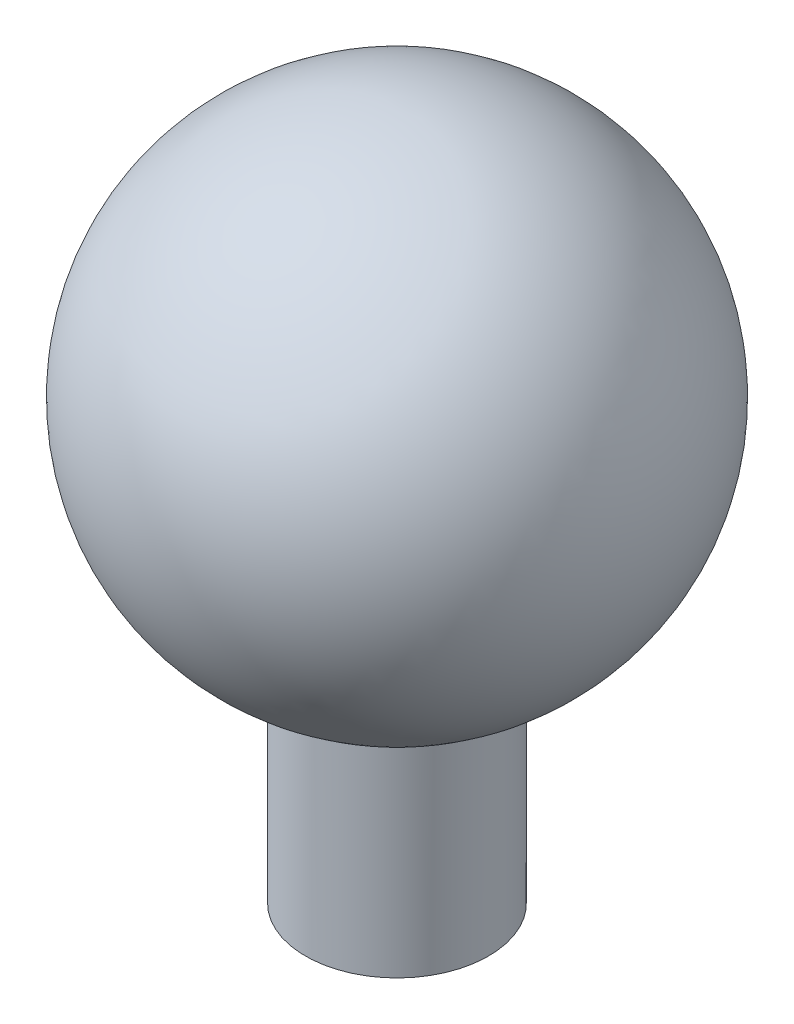
ISO-10303-21;
HEADER;
FILE_DESCRIPTION(('STEP AP214'),'2;1');
FILE_NAME('part.step','',(''),(''),'','','');
FILE_SCHEMA(('AUTOMOTIVE_DESIGN { 1 0 10303 214 1 1 1 1 }'));
ENDSEC;
DATA;
#1=APPLICATION_CONTEXT('core data for automotive mechanical design processes');
#2=APPLICATION_PROTOCOL_DEFINITION('international standard','automotive_design',2000,#1);
#3=PRODUCT_CONTEXT('',#1,'mechanical');
#4=PRODUCT('Part','Part','',(#3));
#5=PRODUCT_RELATED_PRODUCT_CATEGORY('part','',(#4));
#6=PRODUCT_DEFINITION_FORMATION('','',#4);
#7=PRODUCT_DEFINITION_CONTEXT('part definition',#1,'design');
#8=PRODUCT_DEFINITION('design','',#6,#7);
#9=PRODUCT_DEFINITION_SHAPE('','',#8);
#10=(LENGTH_UNIT() NAMED_UNIT(*) SI_UNIT(.MILLI.,.METRE.));
#11=(NAMED_UNIT(*) PLANE_ANGLE_UNIT() SI_UNIT($,.RADIAN.));
#12=(NAMED_UNIT(*) SI_UNIT($,.STERADIAN.) SOLID_ANGLE_UNIT());
#13=UNCERTAINTY_MEASURE_WITH_UNIT(LENGTH_MEASURE(1.E-05),#10,'distance_accuracy_value','');
#14=(GEOMETRIC_REPRESENTATION_CONTEXT(3) GLOBAL_UNCERTAINTY_ASSIGNED_CONTEXT((#13)) GLOBAL_UNIT_ASSIGNED_CONTEXT((#10,
#11,#12)) REPRESENTATION_CONTEXT('',''));
#15=CARTESIAN_POINT('',(0.,0.,0.));
#16=DIRECTION('',(0.,0.,1.));
#17=DIRECTION('',(1.,0.,0.));
#18=AXIS2_PLACEMENT_3D('',#15,#16,#17);
#19=CARTESIAN_POINT('',(0.,57.5,0.));
#20=DIRECTION('',(0.,-1.,0.));
#21=DIRECTION('',(1.,0.,0.));
#22=AXIS2_PLACEMENT_3D('',#19,#20,#21);
#23=SPHERICAL_SURFACE('',#22,32.5);
#24=CARTESIAN_POINT('',(0.,27.2965233789221,0.));
#25=DIRECTION('',(0.,-1.,0.));
#26=DIRECTION('',(0.,0.,-1.));
#27=AXIS2_PLACEMENT_3D('',#24,#25,#26);
#28=CIRCLE('',#27,12.);
#29=CARTESIAN_POINT('',(0.,27.2965233789221,-12.));
#30=VERTEX_POINT('',#29);
#31=EDGE_CURVE('E10',#30,#30,#28,.T.);
#32=ORIENTED_EDGE('',*,*,#31,.F.);
#33=EDGE_LOOP('',(#32));
#34=FACE_BOUND('',#33,.T.);
#35=ADVANCED_FACE('F45',(#34),#23,.T.);
#36=CARTESIAN_POINT('',(0.,0.,0.));
#37=DIRECTION('',(0.,-1.,0.));
#38=DIRECTION('',(0.,0.,-1.));
#39=AXIS2_PLACEMENT_3D('',#36,#37,#38);
#40=CYLINDRICAL_SURFACE('',#39,12.);
#41=CARTESIAN_POINT('',(0.,0.,0.));
#42=DIRECTION('',(0.,-1.,0.));
#43=DIRECTION('',(0.,0.,-1.));
#44=AXIS2_PLACEMENT_3D('',#41,#42,#43);
#45=CIRCLE('',#44,12.);
#46=CARTESIAN_POINT('',(0.,0.,-12.));
#47=VERTEX_POINT('',#46);
#48=EDGE_CURVE('E51',#47,#47,#45,.T.);
#49=ORIENTED_EDGE('',*,*,#48,.F.);
#50=EDGE_LOOP('',(#49));
#51=FACE_BOUND('',#50,.T.);
#52=ORIENTED_EDGE('',*,*,#31,.T.);
#53=EDGE_LOOP('',(#52));
#54=FACE_BOUND('',#53,.T.);
#55=ADVANCED_FACE('F69',(#51,#54),#40,.T.);
#56=CARTESIAN_POINT('',(0.,0.,0.));
#57=DIRECTION('',(0.,1.,0.));
#58=DIRECTION('',(0.,0.,1.));
#59=AXIS2_PLACEMENT_3D('',#56,#57,#58);
#60=PLANE('',#59);
#61=CARTESIAN_POINT('',(0.,0.,0.));
#62=DIRECTION('',(0.,-1.,0.));
#63=DIRECTION('',(0.,0.,-1.));
#64=AXIS2_PLACEMENT_3D('',#61,#62,#63);
#65=CIRCLE('',#64,5.);
#66=CARTESIAN_POINT('',(0.,0.,-5.));
#67=VERTEX_POINT('',#66);
#68=EDGE_CURVE('E59',#67,#67,#65,.T.);
#69=ORIENTED_EDGE('',*,*,#68,.F.);
#70=EDGE_LOOP('',(#69));
#71=FACE_BOUND('',#70,.T.);
#72=ORIENTED_EDGE('',*,*,#48,.T.);
#73=EDGE_LOOP('',(#72));
#74=FACE_BOUND('',#73,.T.);
#75=ADVANCED_FACE('F67',(#71,#74),#60,.F.);
#76=CARTESIAN_POINT('',(0.,30.,0.));
#77=DIRECTION('',(0.,-1.,0.));
#78=DIRECTION('',(0.,0.,-1.));
#79=AXIS2_PLACEMENT_3D('',#76,#77,#78);
#80=CYLINDRICAL_SURFACE('',#79,5.);
#81=CARTESIAN_POINT('',(0.,30.,0.));
#82=DIRECTION('',(0.,-1.,0.));
#83=DIRECTION('',(0.,0.,-1.));
#84=AXIS2_PLACEMENT_3D('',#81,#82,#83);
#85=CIRCLE('',#84,5.);
#86=CARTESIAN_POINT('',(0.,30.,-5.));
#87=VERTEX_POINT('',#86);
#88=EDGE_CURVE('E55',#87,#87,#85,.T.);
#89=ORIENTED_EDGE('',*,*,#88,.F.);
#90=EDGE_LOOP('',(#89));
#91=FACE_BOUND('',#90,.T.);
#92=ORIENTED_EDGE('',*,*,#68,.T.);
#93=EDGE_LOOP('',(#92));
#94=FACE_BOUND('',#93,.T.);
#95=ADVANCED_FACE('F65',(#91,#94),#80,.F.);
#96=CARTESIAN_POINT('',(0.,30.,0.));
#97=DIRECTION('',(0.,-1.,0.));
#98=DIRECTION('',(0.,0.,-1.));
#99=AXIS2_PLACEMENT_3D('',#96,#97,#98);
#100=PLANE('',#99);
#101=ORIENTED_EDGE('',*,*,#88,.T.);
#102=EDGE_LOOP('',(#101));
#103=FACE_BOUND('',#102,.T.);
#104=ADVANCED_FACE('F75',(#103),#100,.T.);
#105=CLOSED_SHELL('',(#35,#55,#75,#95,#104));
#106=MANIFOLD_SOLID_BREP('B2',#105);
#107=ADVANCED_BREP_SHAPE_REPRESENTATION('',(#18,#106),#14);
#108=SHAPE_DEFINITION_REPRESENTATION(#9,#107);
ENDSEC;
END-ISO-10303-21;
